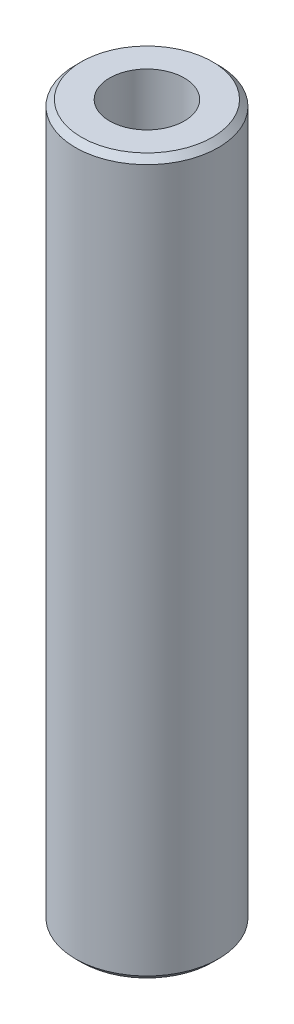
ISO-10303-21;
HEADER;
FILE_DESCRIPTION(('STEP AP214'),'2;1');
FILE_NAME('part.step','',(''),(''),'','','');
FILE_SCHEMA(('AUTOMOTIVE_DESIGN { 1 0 10303 214 1 1 1 1 }'));
ENDSEC;
DATA;
#1=APPLICATION_CONTEXT('core data for automotive mechanical design processes');
#2=APPLICATION_PROTOCOL_DEFINITION('international standard','automotive_design',2000,#1);
#3=PRODUCT_CONTEXT('',#1,'mechanical');
#4=PRODUCT('Part','Part','',(#3));
#5=PRODUCT_RELATED_PRODUCT_CATEGORY('part','',(#4));
#6=PRODUCT_DEFINITION_FORMATION('','',#4);
#7=PRODUCT_DEFINITION_CONTEXT('part definition',#1,'design');
#8=PRODUCT_DEFINITION('design','',#6,#7);
#9=PRODUCT_DEFINITION_SHAPE('','',#8);
#10=(LENGTH_UNIT() NAMED_UNIT(*) SI_UNIT(.MILLI.,.METRE.));
#11=(NAMED_UNIT(*) PLANE_ANGLE_UNIT() SI_UNIT($,.RADIAN.));
#12=(NAMED_UNIT(*) SI_UNIT($,.STERADIAN.) SOLID_ANGLE_UNIT());
#13=UNCERTAINTY_MEASURE_WITH_UNIT(LENGTH_MEASURE(1.E-05),#10,'distance_accuracy_value','');
#14=(GEOMETRIC_REPRESENTATION_CONTEXT(3) GLOBAL_UNCERTAINTY_ASSIGNED_CONTEXT((#13)) GLOBAL_UNIT_ASSIGNED_CONTEXT((#10,
#11,#12)) REPRESENTATION_CONTEXT('',''));
#15=CARTESIAN_POINT('',(0.,0.,0.));
#16=DIRECTION('',(0.,0.,1.));
#17=DIRECTION('',(1.,0.,0.));
#18=AXIS2_PLACEMENT_3D('',#15,#16,#17);
#19=CARTESIAN_POINT('',(0.,23.8125,0.));
#20=DIRECTION('',(0.,-1.,0.));
#21=DIRECTION('',(0.,0.,-1.));
#22=AXIS2_PLACEMENT_3D('',#19,#20,#21);
#23=CYLINDRICAL_SURFACE('',#22,4.7625);
#24=CARTESIAN_POINT('',(0.,-23.415625,0.));
#25=DIRECTION('',(0.,1.,0.));
#26=DIRECTION('',(0.,0.,1.));
#27=AXIS2_PLACEMENT_3D('',#24,#25,#26);
#28=CIRCLE('',#27,4.7625);
#29=CARTESIAN_POINT('',(0.,-23.415625,4.7625));
#30=VERTEX_POINT('',#29);
#31=EDGE_CURVE('E45',#30,#30,#28,.T.);
#32=ORIENTED_EDGE('',*,*,#31,.T.);
#33=EDGE_LOOP('',(#32));
#34=FACE_BOUND('',#33,.T.);
#35=CARTESIAN_POINT('',(0.,23.415625,0.));
#36=DIRECTION('',(0.,1.,0.));
#37=DIRECTION('',(0.,0.,1.));
#38=AXIS2_PLACEMENT_3D('',#35,#36,#37);
#39=CIRCLE('',#38,4.7625);
#40=CARTESIAN_POINT('',(0.,23.415625,4.7625));
#41=VERTEX_POINT('',#40);
#42=EDGE_CURVE('E49',#41,#41,#39,.F.);
#43=ORIENTED_EDGE('',*,*,#42,.T.);
#44=EDGE_LOOP('',(#43));
#45=FACE_BOUND('',#44,.T.);
#46=ADVANCED_FACE('F33',(#34,#45),#23,.T.);
#47=CARTESIAN_POINT('',(0.,23.8125,0.));
#48=DIRECTION('',(0.,1.,0.));
#49=DIRECTION('',(0.,0.,1.));
#50=AXIS2_PLACEMENT_3D('',#47,#48,#49);
#51=PLANE('',#50);
#52=CARTESIAN_POINT('',(0.,23.8125,0.));
#53=DIRECTION('',(0.,1.,0.));
#54=DIRECTION('',(0.,0.,1.));
#55=AXIS2_PLACEMENT_3D('',#52,#53,#54);
#56=CIRCLE('',#55,2.4892);
#57=CARTESIAN_POINT('',(0.,23.8125,2.4892));
#58=VERTEX_POINT('',#57);
#59=EDGE_CURVE('E57',#58,#58,#56,.T.);
#60=ORIENTED_EDGE('',*,*,#59,.F.);
#61=EDGE_LOOP('',(#60));
#62=FACE_BOUND('',#61,.T.);
#63=CARTESIAN_POINT('',(0.,23.8125,0.));
#64=DIRECTION('',(0.,1.,0.));
#65=DIRECTION('',(0.,0.,1.));
#66=AXIS2_PLACEMENT_3D('',#63,#64,#65);
#67=CIRCLE('',#66,4.36562499999999);
#68=CARTESIAN_POINT('',(0.,23.8125,4.36562499999999));
#69=VERTEX_POINT('',#68);
#70=EDGE_CURVE('E10',#69,#69,#67,.T.);
#71=ORIENTED_EDGE('',*,*,#70,.T.);
#72=EDGE_LOOP('',(#71));
#73=FACE_BOUND('',#72,.T.);
#74=ADVANCED_FACE('F63',(#62,#73),#51,.T.);
#75=CARTESIAN_POINT('',(0.,-23.8125,0.));
#76=DIRECTION('',(0.,1.,0.));
#77=DIRECTION('',(0.,0.,1.));
#78=AXIS2_PLACEMENT_3D('',#75,#76,#77);
#79=PLANE('',#78);
#80=CARTESIAN_POINT('',(0.,-23.8125,0.));
#81=DIRECTION('',(0.,1.,0.));
#82=DIRECTION('',(0.,0.,1.));
#83=AXIS2_PLACEMENT_3D('',#80,#81,#82);
#84=CIRCLE('',#83,2.4892);
#85=CARTESIAN_POINT('',(0.,-23.8125,2.4892));
#86=VERTEX_POINT('',#85);
#87=EDGE_CURVE('E54',#86,#86,#84,.T.);
#88=ORIENTED_EDGE('',*,*,#87,.T.);
#89=EDGE_LOOP('',(#88));
#90=FACE_BOUND('',#89,.T.);
#91=CARTESIAN_POINT('',(0.,-23.8125,0.));
#92=DIRECTION('',(0.,1.,0.));
#93=DIRECTION('',(0.,0.,1.));
#94=AXIS2_PLACEMENT_3D('',#91,#92,#93);
#95=CIRCLE('',#94,4.365625);
#96=CARTESIAN_POINT('',(0.,-23.8125,4.365625));
#97=VERTEX_POINT('',#96);
#98=EDGE_CURVE('E41',#97,#97,#95,.F.);
#99=ORIENTED_EDGE('',*,*,#98,.T.);
#100=EDGE_LOOP('',(#99));
#101=FACE_BOUND('',#100,.T.);
#102=ADVANCED_FACE('F65',(#90,#101),#79,.F.);
#103=CARTESIAN_POINT('',(0.,-23.415625,0.));
#104=DIRECTION('',(0.,1.,0.));
#105=DIRECTION('',(0.,0.,1.));
#106=AXIS2_PLACEMENT_3D('',#103,#104,#105);
#107=CONICAL_SURFACE('',#106,4.7625,0.785398163397454);
#108=ORIENTED_EDGE('',*,*,#98,.F.);
#109=EDGE_LOOP('',(#108));
#110=FACE_BOUND('',#109,.T.);
#111=ORIENTED_EDGE('',*,*,#31,.F.);
#112=EDGE_LOOP('',(#111));
#113=FACE_BOUND('',#112,.T.);
#114=ADVANCED_FACE('F71',(#110,#113),#107,.T.);
#115=CARTESIAN_POINT('',(0.,23.8125,0.));
#116=DIRECTION('',(0.,-1.,0.));
#117=DIRECTION('',(0.,0.,-1.));
#118=AXIS2_PLACEMENT_3D('',#115,#116,#117);
#119=CONICAL_SURFACE('',#118,4.36562499999999,0.785398163397441);
#120=ORIENTED_EDGE('',*,*,#42,.F.);
#121=EDGE_LOOP('',(#120));
#122=FACE_BOUND('',#121,.T.);
#123=ORIENTED_EDGE('',*,*,#70,.F.);
#124=EDGE_LOOP('',(#123));
#125=FACE_BOUND('',#124,.T.);
#126=ADVANCED_FACE('F36',(#122,#125),#119,.T.);
#127=CARTESIAN_POINT('',(0.,-23.8125,0.));
#128=DIRECTION('',(0.,1.,0.));
#129=DIRECTION('',(0.,0.,1.));
#130=AXIS2_PLACEMENT_3D('',#127,#128,#129);
#131=CYLINDRICAL_SURFACE('',#130,2.4892);
#132=ORIENTED_EDGE('',*,*,#87,.F.);
#133=EDGE_LOOP('',(#132));
#134=FACE_BOUND('',#133,.T.);
#135=ORIENTED_EDGE('',*,*,#59,.T.);
#136=EDGE_LOOP('',(#135));
#137=FACE_BOUND('',#136,.T.);
#138=ADVANCED_FACE('F61',(#134,#137),#131,.F.);
#139=CLOSED_SHELL('',(#46,#74,#102,#114,#126,#138));
#140=MANIFOLD_SOLID_BREP('B2',#139);
#141=ADVANCED_BREP_SHAPE_REPRESENTATION('',(#18,#140),#14);
#142=SHAPE_DEFINITION_REPRESENTATION(#9,#141);
ENDSEC;
END-ISO-10303-21;
